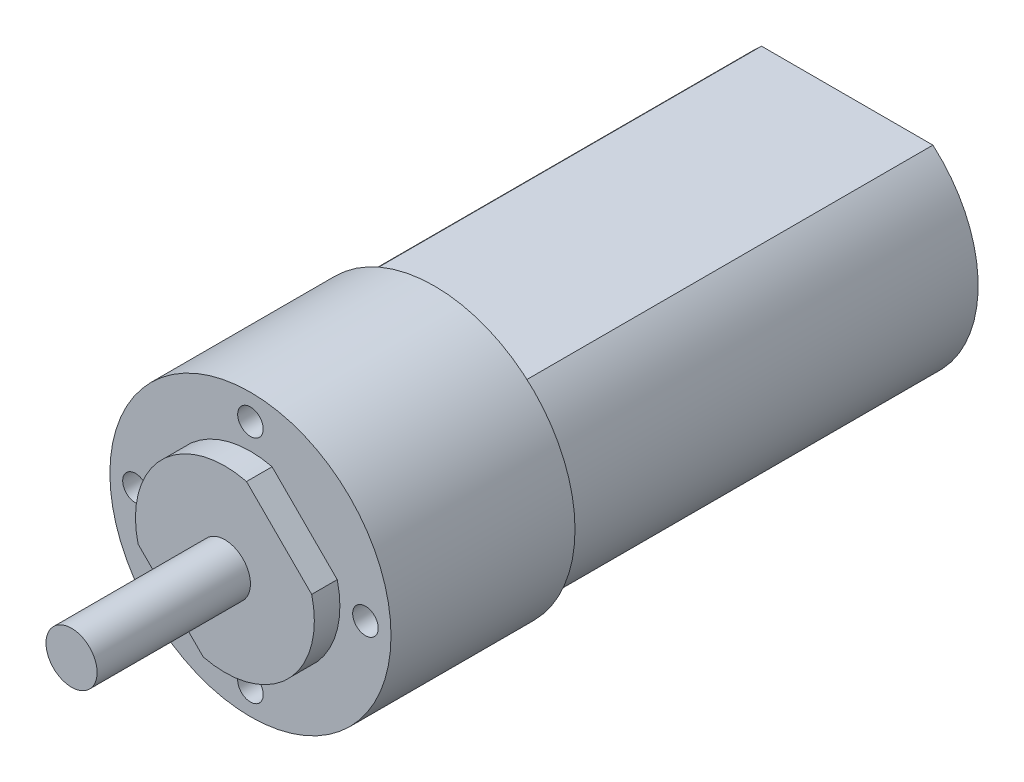
ISO-10303-21;
HEADER;
FILE_DESCRIPTION(('STEP AP214'),'2;1');
FILE_NAME('part.step','',(''),(''),'','','');
FILE_SCHEMA(('AUTOMOTIVE_DESIGN { 1 0 10303 214 1 1 1 1 }'));
ENDSEC;
DATA;
#1=APPLICATION_CONTEXT('core data for automotive mechanical design processes');
#2=APPLICATION_PROTOCOL_DEFINITION('international standard','automotive_design',2000,#1);
#3=PRODUCT_CONTEXT('',#1,'mechanical');
#4=PRODUCT('Part','Part','',(#3));
#5=PRODUCT_RELATED_PRODUCT_CATEGORY('part','',(#4));
#6=PRODUCT_DEFINITION_FORMATION('','',#4);
#7=PRODUCT_DEFINITION_CONTEXT('part definition',#1,'design');
#8=PRODUCT_DEFINITION('design','',#6,#7);
#9=PRODUCT_DEFINITION_SHAPE('','',#8);
#10=(LENGTH_UNIT() NAMED_UNIT(*) SI_UNIT(.MILLI.,.METRE.));
#11=(NAMED_UNIT(*) PLANE_ANGLE_UNIT() SI_UNIT($,.RADIAN.));
#12=(NAMED_UNIT(*) SI_UNIT($,.STERADIAN.) SOLID_ANGLE_UNIT());
#13=UNCERTAINTY_MEASURE_WITH_UNIT(LENGTH_MEASURE(1.E-05),#10,'distance_accuracy_value','');
#14=(GEOMETRIC_REPRESENTATION_CONTEXT(3) GLOBAL_UNCERTAINTY_ASSIGNED_CONTEXT((#13)) GLOBAL_UNIT_ASSIGNED_CONTEXT((#10,
#11,#12)) REPRESENTATION_CONTEXT('',''));
#15=CARTESIAN_POINT('',(0.,0.,0.));
#16=DIRECTION('',(0.,0.,1.));
#17=DIRECTION('',(1.,0.,0.));
#18=AXIS2_PLACEMENT_3D('',#15,#16,#17);
#19=CARTESIAN_POINT('',(0.,0.,48.7));
#20=DIRECTION('',(0.,0.,-1.));
#21=DIRECTION('',(-1.,0.,0.));
#22=AXIS2_PLACEMENT_3D('',#19,#20,#21);
#23=PLANE('',#22);
#24=CARTESIAN_POINT('',(0.,0.,48.7));
#25=DIRECTION('',(0.,0.,1.));
#26=DIRECTION('',(-1.,0.,0.));
#27=AXIS2_PLACEMENT_3D('',#24,#25,#26);
#28=CIRCLE('',#27,7.);
#29=CARTESIAN_POINT('',(-1.69313093032285,-6.79215044391569,48.7));
#30=VERTEX_POINT('',#29);
#31=CARTESIAN_POINT('',(6.79215044391567,1.69313093032293,48.7));
#32=VERTEX_POINT('',#31);
#33=EDGE_CURVE('E119',#30,#32,#28,.T.);
#34=ORIENTED_EDGE('',*,*,#33,.T.);
#35=DIRECTION('',(-0.707106781186551,0.707106781186543,0.));
#36=VECTOR('',#35,1.);
#37=CARTESIAN_POINT('',(1.69313093032285,6.79215044391569,48.7));
#38=LINE('',#37,#36);
#39=CARTESIAN_POINT('',(1.69313093032285,6.79215044391569,48.7));
#40=VERTEX_POINT('',#39);
#41=EDGE_CURVE('E108',#32,#40,#38,.T.);
#42=ORIENTED_EDGE('',*,*,#41,.T.);
#43=CARTESIAN_POINT('',(0.,0.,48.7));
#44=DIRECTION('',(0.,0.,1.));
#45=DIRECTION('',(-1.,0.,0.));
#46=AXIS2_PLACEMENT_3D('',#43,#44,#45);
#47=CIRCLE('',#46,7.);
#48=CARTESIAN_POINT('',(-6.79215044391567,-1.69313093032293,48.7));
#49=VERTEX_POINT('',#48);
#50=EDGE_CURVE('E118',#40,#49,#47,.T.);
#51=ORIENTED_EDGE('',*,*,#50,.T.);
#52=DIRECTION('',(0.707106781186552,-0.707106781186543,0.));
#53=VECTOR('',#52,1.);
#54=CARTESIAN_POINT('',(-1.69313093032285,-6.79215044391569,48.7));
#55=LINE('',#54,#53);
#56=EDGE_CURVE('E123',#49,#30,#55,.T.);
#57=ORIENTED_EDGE('',*,*,#56,.T.);
#58=EDGE_LOOP('',(#34,#42,#51,#57));
#59=FACE_BOUND('',#58,.T.);
#60=CARTESIAN_POINT('',(0.,0.,48.7));
#61=DIRECTION('',(0.,0.,-1.));
#62=DIRECTION('',(-1.,0.,0.));
#63=AXIS2_PLACEMENT_3D('',#60,#61,#62);
#64=CIRCLE('',#63,2.);
#65=CARTESIAN_POINT('',(-2.,0.,48.7));
#66=VERTEX_POINT('',#65);
#67=EDGE_CURVE('E11',#66,#66,#64,.F.);
#68=ORIENTED_EDGE('',*,*,#67,.F.);
#69=EDGE_LOOP('',(#68));
#70=FACE_BOUND('',#69,.T.);
#71=ADVANCED_FACE('F32',(#59,#70),#23,.F.);
#72=CARTESIAN_POINT('',(0.,0.,46.7));
#73=DIRECTION('',(0.,0.,1.));
#74=DIRECTION('',(1.,0.,0.));
#75=AXIS2_PLACEMENT_3D('',#72,#73,#74);
#76=PLANE('',#75);
#77=CARTESIAN_POINT('',(0.,-9.,46.7));
#78=DIRECTION('',(0.,0.,1.));
#79=DIRECTION('',(1.,0.,0.));
#80=AXIS2_PLACEMENT_3D('',#77,#78,#79);
#81=CIRCLE('',#80,1.);
#82=CARTESIAN_POINT('',(1.00000000000007,-9.,46.7));
#83=VERTEX_POINT('',#82);
#84=EDGE_CURVE('E391',#83,#83,#81,.T.);
#85=ORIENTED_EDGE('',*,*,#84,.F.);
#86=EDGE_LOOP('',(#85));
#87=FACE_BOUND('',#86,.T.);
#88=CARTESIAN_POINT('',(9.,0.,46.7));
#89=DIRECTION('',(0.,0.,1.));
#90=DIRECTION('',(1.,0.,0.));
#91=AXIS2_PLACEMENT_3D('',#88,#89,#90);
#92=CIRCLE('',#91,1.);
#93=CARTESIAN_POINT('',(10.,0.,46.7));
#94=VERTEX_POINT('',#93);
#95=EDGE_CURVE('E390',#94,#94,#92,.T.);
#96=ORIENTED_EDGE('',*,*,#95,.F.);
#97=EDGE_LOOP('',(#96));
#98=FACE_BOUND('',#97,.T.);
#99=CARTESIAN_POINT('',(0.,9.,46.7));
#100=DIRECTION('',(0.,0.,1.));
#101=DIRECTION('',(1.,0.,0.));
#102=AXIS2_PLACEMENT_3D('',#99,#100,#101);
#103=CIRCLE('',#102,0.999999999999999);
#104=CARTESIAN_POINT('',(0.999999999999928,9.,46.7));
#105=VERTEX_POINT('',#104);
#106=EDGE_CURVE('E400',#105,#105,#103,.T.);
#107=ORIENTED_EDGE('',*,*,#106,.F.);
#108=EDGE_LOOP('',(#107));
#109=FACE_BOUND('',#108,.T.);
#110=CARTESIAN_POINT('',(-9.,0.,46.7));
#111=DIRECTION('',(0.,0.,1.));
#112=DIRECTION('',(1.,0.,0.));
#113=AXIS2_PLACEMENT_3D('',#110,#111,#112);
#114=CIRCLE('',#113,1.);
#115=CARTESIAN_POINT('',(-8.,0.,46.7));
#116=VERTEX_POINT('',#115);
#117=EDGE_CURVE('E405',#116,#116,#114,.T.);
#118=ORIENTED_EDGE('',*,*,#117,.F.);
#119=EDGE_LOOP('',(#118));
#120=FACE_BOUND('',#119,.T.);
#121=CARTESIAN_POINT('',(0.,0.,46.7));
#122=DIRECTION('',(0.,0.,1.));
#123=DIRECTION('',(1.,0.,0.));
#124=AXIS2_PLACEMENT_3D('',#121,#122,#123);
#125=CIRCLE('',#124,11.);
#126=CARTESIAN_POINT('',(11.,0.,46.7));
#127=VERTEX_POINT('',#126);
#128=EDGE_CURVE('E136',#127,#127,#125,.T.);
#129=ORIENTED_EDGE('',*,*,#128,.T.);
#130=EDGE_LOOP('',(#129));
#131=FACE_BOUND('',#130,.T.);
#132=DIRECTION('',(-0.707106781186551,0.707106781186543,0.));
#133=VECTOR('',#132,1.);
#134=CARTESIAN_POINT('',(1.69313093032285,6.79215044391569,46.7));
#135=LINE('',#134,#133);
#136=CARTESIAN_POINT('',(6.79215044391567,1.69313093032293,46.7));
#137=VERTEX_POINT('',#136);
#138=CARTESIAN_POINT('',(1.69313093032285,6.79215044391569,46.7));
#139=VERTEX_POINT('',#138);
#140=EDGE_CURVE('E420',#137,#139,#135,.T.);
#141=ORIENTED_EDGE('',*,*,#140,.F.);
#142=CARTESIAN_POINT('',(0.,0.,46.7));
#143=DIRECTION('',(0.,0.,1.));
#144=DIRECTION('',(-1.,0.,0.));
#145=AXIS2_PLACEMENT_3D('',#142,#143,#144);
#146=CIRCLE('',#145,7.);
#147=CARTESIAN_POINT('',(-1.69313093032285,-6.79215044391569,46.7));
#148=VERTEX_POINT('',#147);
#149=EDGE_CURVE('E131',#148,#137,#146,.T.);
#150=ORIENTED_EDGE('',*,*,#149,.F.);
#151=DIRECTION('',(0.707106781186552,-0.707106781186543,0.));
#152=VECTOR('',#151,1.);
#153=CARTESIAN_POINT('',(-1.69313093032285,-6.79215044391569,46.7));
#154=LINE('',#153,#152);
#155=CARTESIAN_POINT('',(-6.79215044391567,-1.69313093032293,46.7));
#156=VERTEX_POINT('',#155);
#157=EDGE_CURVE('E127',#156,#148,#154,.T.);
#158=ORIENTED_EDGE('',*,*,#157,.F.);
#159=CARTESIAN_POINT('',(0.,0.,46.7));
#160=DIRECTION('',(0.,0.,1.));
#161=DIRECTION('',(-1.,0.,0.));
#162=AXIS2_PLACEMENT_3D('',#159,#160,#161);
#163=CIRCLE('',#162,7.);
#164=EDGE_CURVE('E422',#139,#156,#163,.T.);
#165=ORIENTED_EDGE('',*,*,#164,.F.);
#166=EDGE_LOOP('',(#141,#150,#158,#165));
#167=FACE_BOUND('',#166,.T.);
#168=ADVANCED_FACE('F190',(#87,#98,#109,#120,#131,#167),#76,.T.);
#169=CARTESIAN_POINT('',(0.,0.,32.3));
#170=DIRECTION('',(0.,0.,-1.));
#171=DIRECTION('',(-1.,0.,0.));
#172=AXIS2_PLACEMENT_3D('',#169,#170,#171);
#173=CYLINDRICAL_SURFACE('',#172,10.25);
#174=CARTESIAN_POINT('',(0.,0.,0.));
#175=DIRECTION('',(0.,0.,1.));
#176=DIRECTION('',(-1.,0.,0.));
#177=AXIS2_PLACEMENT_3D('',#174,#175,#176);
#178=CIRCLE('',#177,10.25);
#179=CARTESIAN_POINT('',(6.70820393249937,-7.75,0.));
#180=VERTEX_POINT('',#179);
#181=CARTESIAN_POINT('',(6.70820393249938,7.75,0.));
#182=VERTEX_POINT('',#181);
#183=EDGE_CURVE('E142',#180,#182,#178,.T.);
#184=ORIENTED_EDGE('',*,*,#183,.T.);
#185=DIRECTION('',(0.,0.,-1.));
#186=VECTOR('',#185,1.);
#187=CARTESIAN_POINT('',(6.70820393249938,7.75,32.3));
#188=LINE('',#187,#186);
#189=CARTESIAN_POINT('',(6.70820393249938,7.75,32.3));
#190=VERTEX_POINT('',#189);
#191=EDGE_CURVE('E40',#190,#182,#188,.T.);
#192=ORIENTED_EDGE('',*,*,#191,.F.);
#193=CARTESIAN_POINT('',(0.,0.,32.3));
#194=DIRECTION('',(0.,0.,1.));
#195=DIRECTION('',(-1.,0.,0.));
#196=AXIS2_PLACEMENT_3D('',#193,#194,#195);
#197=CIRCLE('',#196,10.25);
#198=CARTESIAN_POINT('',(6.70820393249937,-7.75,32.3));
#199=VERTEX_POINT('',#198);
#200=EDGE_CURVE('E144',#199,#190,#197,.T.);
#201=ORIENTED_EDGE('',*,*,#200,.F.);
#202=DIRECTION('',(0.,0.,-1.));
#203=VECTOR('',#202,1.);
#204=CARTESIAN_POINT('',(6.70820393249937,-7.75,32.3));
#205=LINE('',#204,#203);
#206=EDGE_CURVE('E154',#199,#180,#205,.T.);
#207=ORIENTED_EDGE('',*,*,#206,.T.);
#208=EDGE_LOOP('',(#184,#192,#201,#207));
#209=FACE_BOUND('',#208,.T.);
#210=ADVANCED_FACE('F34',(#209),#173,.T.);
#211=CARTESIAN_POINT('',(-6.70820393249938,7.75,32.3));
#212=DIRECTION('',(0.,-1.,0.));
#213=DIRECTION('',(0.,0.,-1.));
#214=AXIS2_PLACEMENT_3D('',#211,#212,#213);
#215=PLANE('',#214);
#216=DIRECTION('',(-1.,0.,0.));
#217=VECTOR('',#216,1.);
#218=CARTESIAN_POINT('',(-6.70820393249938,7.75,0.));
#219=LINE('',#218,#217);
#220=CARTESIAN_POINT('',(-6.70820393249938,7.75,0.));
#221=VERTEX_POINT('',#220);
#222=EDGE_CURVE('E157',#182,#221,#219,.T.);
#223=ORIENTED_EDGE('',*,*,#222,.T.);
#224=DIRECTION('',(0.,0.,-1.));
#225=VECTOR('',#224,1.);
#226=CARTESIAN_POINT('',(-6.70820393249938,7.75,32.3));
#227=LINE('',#226,#225);
#228=CARTESIAN_POINT('',(-6.70820393249938,7.75,32.3));
#229=VERTEX_POINT('',#228);
#230=EDGE_CURVE('E164',#229,#221,#227,.T.);
#231=ORIENTED_EDGE('',*,*,#230,.F.);
#232=DIRECTION('',(-1.,0.,0.));
#233=VECTOR('',#232,1.);
#234=CARTESIAN_POINT('',(-6.70820393249938,7.75,32.3));
#235=LINE('',#234,#233);
#236=EDGE_CURVE('E82',#190,#229,#235,.T.);
#237=ORIENTED_EDGE('',*,*,#236,.F.);
#238=ORIENTED_EDGE('',*,*,#191,.T.);
#239=EDGE_LOOP('',(#223,#231,#237,#238));
#240=FACE_BOUND('',#239,.T.);
#241=ADVANCED_FACE('F166',(#240),#215,.F.);
#242=CARTESIAN_POINT('',(0.,0.,32.3));
#243=DIRECTION('',(0.,0.,-1.));
#244=DIRECTION('',(-1.,0.,0.));
#245=AXIS2_PLACEMENT_3D('',#242,#243,#244);
#246=CYLINDRICAL_SURFACE('',#245,10.25);
#247=CARTESIAN_POINT('',(0.,0.,0.));
#248=DIRECTION('',(0.,0.,1.));
#249=DIRECTION('',(1.,0.,0.));
#250=AXIS2_PLACEMENT_3D('',#247,#248,#249);
#251=CIRCLE('',#250,10.25);
#252=CARTESIAN_POINT('',(-6.70820393249937,-7.75,0.));
#253=VERTEX_POINT('',#252);
#254=EDGE_CURVE('E159',#221,#253,#251,.T.);
#255=ORIENTED_EDGE('',*,*,#254,.T.);
#256=DIRECTION('',(0.,0.,-1.));
#257=VECTOR('',#256,1.);
#258=CARTESIAN_POINT('',(-6.70820393249937,-7.75,32.3));
#259=LINE('',#258,#257);
#260=CARTESIAN_POINT('',(-6.70820393249937,-7.75,32.3));
#261=VERTEX_POINT('',#260);
#262=EDGE_CURVE('E56',#261,#253,#259,.T.);
#263=ORIENTED_EDGE('',*,*,#262,.F.);
#264=CARTESIAN_POINT('',(0.,0.,32.3));
#265=DIRECTION('',(0.,0.,1.));
#266=DIRECTION('',(1.,0.,0.));
#267=AXIS2_PLACEMENT_3D('',#264,#265,#266);
#268=CIRCLE('',#267,10.25);
#269=EDGE_CURVE('E148',#229,#261,#268,.T.);
#270=ORIENTED_EDGE('',*,*,#269,.F.);
#271=ORIENTED_EDGE('',*,*,#230,.T.);
#272=EDGE_LOOP('',(#255,#263,#270,#271));
#273=FACE_BOUND('',#272,.T.);
#274=ADVANCED_FACE('F172',(#273),#246,.T.);
#275=CARTESIAN_POINT('',(6.70820393249937,-7.75,32.3));
#276=DIRECTION('',(0.,1.,0.));
#277=DIRECTION('',(-1.,0.,0.));
#278=AXIS2_PLACEMENT_3D('',#275,#276,#277);
#279=PLANE('',#278);
#280=DIRECTION('',(1.,0.,0.));
#281=VECTOR('',#280,1.);
#282=CARTESIAN_POINT('',(6.70820393249937,-7.75,0.));
#283=LINE('',#282,#281);
#284=EDGE_CURVE('E76',#253,#180,#283,.T.);
#285=ORIENTED_EDGE('',*,*,#284,.T.);
#286=ORIENTED_EDGE('',*,*,#206,.F.);
#287=DIRECTION('',(1.,0.,0.));
#288=VECTOR('',#287,1.);
#289=CARTESIAN_POINT('',(6.70820393249937,-7.75,32.3));
#290=LINE('',#289,#288);
#291=EDGE_CURVE('E151',#261,#199,#290,.T.);
#292=ORIENTED_EDGE('',*,*,#291,.F.);
#293=ORIENTED_EDGE('',*,*,#262,.T.);
#294=EDGE_LOOP('',(#285,#286,#292,#293));
#295=FACE_BOUND('',#294,.T.);
#296=ADVANCED_FACE('F173',(#295),#279,.F.);
#297=CARTESIAN_POINT('',(0.,0.,0.));
#298=DIRECTION('',(0.,0.,-1.));
#299=DIRECTION('',(-1.,0.,0.));
#300=AXIS2_PLACEMENT_3D('',#297,#298,#299);
#301=PLANE('',#300);
#302=ORIENTED_EDGE('',*,*,#183,.F.);
#303=ORIENTED_EDGE('',*,*,#284,.F.);
#304=ORIENTED_EDGE('',*,*,#254,.F.);
#305=ORIENTED_EDGE('',*,*,#222,.F.);
#306=EDGE_LOOP('',(#302,#303,#304,#305));
#307=FACE_BOUND('',#306,.T.);
#308=ADVANCED_FACE('F170',(#307),#301,.T.);
#309=CARTESIAN_POINT('',(0.,0.,32.3));
#310=DIRECTION('',(0.,0.,1.));
#311=DIRECTION('',(1.,0.,0.));
#312=AXIS2_PLACEMENT_3D('',#309,#310,#311);
#313=PLANE('',#312);
#314=CARTESIAN_POINT('',(0.,0.,32.3));
#315=DIRECTION('',(0.,0.,1.));
#316=DIRECTION('',(1.,0.,0.));
#317=AXIS2_PLACEMENT_3D('',#314,#315,#316);
#318=CIRCLE('',#317,11.);
#319=CARTESIAN_POINT('',(11.,0.,32.3));
#320=VERTEX_POINT('',#319);
#321=EDGE_CURVE('E133',#320,#320,#318,.T.);
#322=ORIENTED_EDGE('',*,*,#321,.F.);
#323=EDGE_LOOP('',(#322));
#324=FACE_BOUND('',#323,.T.);
#325=ORIENTED_EDGE('',*,*,#291,.T.);
#326=ORIENTED_EDGE('',*,*,#200,.T.);
#327=ORIENTED_EDGE('',*,*,#236,.T.);
#328=ORIENTED_EDGE('',*,*,#269,.T.);
#329=EDGE_LOOP('',(#325,#326,#327,#328));
#330=FACE_BOUND('',#329,.T.);
#331=ADVANCED_FACE('F175',(#324,#330),#313,.F.);
#332=CARTESIAN_POINT('',(0.,0.,46.7));
#333=DIRECTION('',(0.,0.,-1.));
#334=DIRECTION('',(-1.,0.,0.));
#335=AXIS2_PLACEMENT_3D('',#332,#333,#334);
#336=CYLINDRICAL_SURFACE('',#335,11.);
#337=ORIENTED_EDGE('',*,*,#128,.F.);
#338=EDGE_LOOP('',(#337));
#339=FACE_BOUND('',#338,.T.);
#340=ORIENTED_EDGE('',*,*,#321,.T.);
#341=EDGE_LOOP('',(#340));
#342=FACE_BOUND('',#341,.T.);
#343=ADVANCED_FACE('F177',(#339,#342),#336,.T.);
#344=CARTESIAN_POINT('',(0.,0.,48.7));
#345=DIRECTION('',(0.,0.,-1.));
#346=DIRECTION('',(-1.,0.,0.));
#347=AXIS2_PLACEMENT_3D('',#344,#345,#346);
#348=CYLINDRICAL_SURFACE('',#347,7.);
#349=ORIENTED_EDGE('',*,*,#149,.T.);
#350=DIRECTION('',(0.,0.,-1.));
#351=VECTOR('',#350,1.);
#352=CARTESIAN_POINT('',(6.79215044391567,1.69313093032293,48.7));
#353=LINE('',#352,#351);
#354=EDGE_CURVE('E112',#32,#137,#353,.T.);
#355=ORIENTED_EDGE('',*,*,#354,.F.);
#356=ORIENTED_EDGE('',*,*,#33,.F.);
#357=DIRECTION('',(0.,0.,-1.));
#358=VECTOR('',#357,1.);
#359=CARTESIAN_POINT('',(-1.69313093032285,-6.79215044391569,48.7));
#360=LINE('',#359,#358);
#361=EDGE_CURVE('E418',#30,#148,#360,.T.);
#362=ORIENTED_EDGE('',*,*,#361,.T.);
#363=EDGE_LOOP('',(#349,#355,#356,#362));
#364=FACE_BOUND('',#363,.T.);
#365=ADVANCED_FACE('F129',(#364),#348,.T.);
#366=CARTESIAN_POINT('',(1.69313093032285,6.79215044391569,48.7));
#367=DIRECTION('',(-0.707106781186543,-0.707106781186552,0.));
#368=DIRECTION('',(0.707106781186552,-0.707106781186543,0.));
#369=AXIS2_PLACEMENT_3D('',#366,#367,#368);
#370=PLANE('',#369);
#371=ORIENTED_EDGE('',*,*,#140,.T.);
#372=DIRECTION('',(0.,0.,-1.));
#373=VECTOR('',#372,1.);
#374=CARTESIAN_POINT('',(1.69313093032285,6.79215044391569,48.7));
#375=LINE('',#374,#373);
#376=EDGE_CURVE('E115',#40,#139,#375,.T.);
#377=ORIENTED_EDGE('',*,*,#376,.F.);
#378=ORIENTED_EDGE('',*,*,#41,.F.);
#379=ORIENTED_EDGE('',*,*,#354,.T.);
#380=EDGE_LOOP('',(#371,#377,#378,#379));
#381=FACE_BOUND('',#380,.T.);
#382=ADVANCED_FACE('F110',(#381),#370,.F.);
#383=CARTESIAN_POINT('',(0.,0.,48.7));
#384=DIRECTION('',(0.,0.,-1.));
#385=DIRECTION('',(-1.,0.,0.));
#386=AXIS2_PLACEMENT_3D('',#383,#384,#385);
#387=CYLINDRICAL_SURFACE('',#386,7.);
#388=ORIENTED_EDGE('',*,*,#164,.T.);
#389=DIRECTION('',(0.,0.,-1.));
#390=VECTOR('',#389,1.);
#391=CARTESIAN_POINT('',(-6.79215044391567,-1.69313093032293,48.7));
#392=LINE('',#391,#390);
#393=EDGE_CURVE('E47',#49,#156,#392,.T.);
#394=ORIENTED_EDGE('',*,*,#393,.F.);
#395=ORIENTED_EDGE('',*,*,#50,.F.);
#396=ORIENTED_EDGE('',*,*,#376,.T.);
#397=EDGE_LOOP('',(#388,#394,#395,#396));
#398=FACE_BOUND('',#397,.T.);
#399=ADVANCED_FACE('F203',(#398),#387,.T.);
#400=CARTESIAN_POINT('',(-1.69313093032285,-6.79215044391569,48.7));
#401=DIRECTION('',(0.707106781186543,0.707106781186552,0.));
#402=DIRECTION('',(-0.707106781186552,0.707106781186543,0.));
#403=AXIS2_PLACEMENT_3D('',#400,#401,#402);
#404=PLANE('',#403);
#405=ORIENTED_EDGE('',*,*,#157,.T.);
#406=ORIENTED_EDGE('',*,*,#361,.F.);
#407=ORIENTED_EDGE('',*,*,#56,.F.);
#408=ORIENTED_EDGE('',*,*,#393,.T.);
#409=EDGE_LOOP('',(#405,#406,#407,#408));
#410=FACE_BOUND('',#409,.T.);
#411=ADVANCED_FACE('F200',(#410),#404,.F.);
#412=CARTESIAN_POINT('',(0.,0.,60.7));
#413=DIRECTION('',(0.,0.,-1.));
#414=DIRECTION('',(-1.,0.,0.));
#415=AXIS2_PLACEMENT_3D('',#412,#413,#414);
#416=CYLINDRICAL_SURFACE('',#415,2.);
#417=CARTESIAN_POINT('',(0.,0.,60.7));
#418=DIRECTION('',(0.,0.,1.));
#419=DIRECTION('',(1.,0.,0.));
#420=AXIS2_PLACEMENT_3D('',#417,#418,#419);
#421=CIRCLE('',#420,2.);
#422=CARTESIAN_POINT('',(2.,0.,60.7));
#423=VERTEX_POINT('',#422);
#424=EDGE_CURVE('E411',#423,#423,#421,.T.);
#425=ORIENTED_EDGE('',*,*,#424,.F.);
#426=EDGE_LOOP('',(#425));
#427=FACE_BOUND('',#426,.T.);
#428=ORIENTED_EDGE('',*,*,#67,.T.);
#429=EDGE_LOOP('',(#428));
#430=FACE_BOUND('',#429,.T.);
#431=ADVANCED_FACE('F198',(#427,#430),#416,.T.);
#432=CARTESIAN_POINT('',(0.,0.,60.7));
#433=DIRECTION('',(0.,0.,1.));
#434=DIRECTION('',(1.,0.,0.));
#435=AXIS2_PLACEMENT_3D('',#432,#433,#434);
#436=PLANE('',#435);
#437=ORIENTED_EDGE('',*,*,#424,.T.);
#438=EDGE_LOOP('',(#437));
#439=FACE_BOUND('',#438,.T.);
#440=ADVANCED_FACE('F232',(#439),#436,.T.);
#441=CARTESIAN_POINT('',(-9.,0.,42.7));
#442=DIRECTION('',(0.,0.,1.));
#443=DIRECTION('',(1.,0.,0.));
#444=AXIS2_PLACEMENT_3D('',#441,#442,#443);
#445=CYLINDRICAL_SURFACE('',#444,1.);
#446=CARTESIAN_POINT('',(-9.,0.,42.7));
#447=DIRECTION('',(0.,0.,1.));
#448=DIRECTION('',(1.,0.,0.));
#449=AXIS2_PLACEMENT_3D('',#446,#447,#448);
#450=CIRCLE('',#449,1.);
#451=CARTESIAN_POINT('',(-8.,0.,42.7));
#452=VERTEX_POINT('',#451);
#453=EDGE_CURVE('E408',#452,#452,#450,.T.);
#454=ORIENTED_EDGE('',*,*,#453,.F.);
#455=EDGE_LOOP('',(#454));
#456=FACE_BOUND('',#455,.T.);
#457=ORIENTED_EDGE('',*,*,#117,.T.);
#458=EDGE_LOOP('',(#457));
#459=FACE_BOUND('',#458,.T.);
#460=ADVANCED_FACE('F239',(#456,#459),#445,.F.);
#461=CARTESIAN_POINT('',(-9.,0.,42.7));
#462=DIRECTION('',(0.,0.,1.));
#463=DIRECTION('',(1.,0.,0.));
#464=AXIS2_PLACEMENT_3D('',#461,#462,#463);
#465=PLANE('',#464);
#466=ORIENTED_EDGE('',*,*,#453,.T.);
#467=EDGE_LOOP('',(#466));
#468=FACE_BOUND('',#467,.T.);
#469=ADVANCED_FACE('F247',(#468),#465,.T.);
#470=CARTESIAN_POINT('',(0.,9.,42.7));
#471=DIRECTION('',(0.,0.,1.));
#472=DIRECTION('',(1.,0.,0.));
#473=AXIS2_PLACEMENT_3D('',#470,#471,#472);
#474=CYLINDRICAL_SURFACE('',#473,0.999999999999999);
#475=CARTESIAN_POINT('',(0.,9.,42.7));
#476=DIRECTION('',(0.,0.,1.));
#477=DIRECTION('',(1.,0.,0.));
#478=AXIS2_PLACEMENT_3D('',#475,#476,#477);
#479=CIRCLE('',#478,0.999999999999999);
#480=CARTESIAN_POINT('',(0.999999999999928,9.,42.7));
#481=VERTEX_POINT('',#480);
#482=EDGE_CURVE('E402',#481,#481,#479,.T.);
#483=ORIENTED_EDGE('',*,*,#482,.F.);
#484=EDGE_LOOP('',(#483));
#485=FACE_BOUND('',#484,.T.);
#486=ORIENTED_EDGE('',*,*,#106,.T.);
#487=EDGE_LOOP('',(#486));
#488=FACE_BOUND('',#487,.T.);
#489=ADVANCED_FACE('F255',(#485,#488),#474,.F.);
#490=CARTESIAN_POINT('',(0.,9.,42.7));
#491=DIRECTION('',(0.,0.,1.));
#492=DIRECTION('',(1.,0.,0.));
#493=AXIS2_PLACEMENT_3D('',#490,#491,#492);
#494=PLANE('',#493);
#495=ORIENTED_EDGE('',*,*,#482,.T.);
#496=EDGE_LOOP('',(#495));
#497=FACE_BOUND('',#496,.T.);
#498=ADVANCED_FACE('F263',(#497),#494,.T.);
#499=CARTESIAN_POINT('',(9.,0.,42.7));
#500=DIRECTION('',(0.,0.,1.));
#501=DIRECTION('',(1.,0.,0.));
#502=AXIS2_PLACEMENT_3D('',#499,#500,#501);
#503=CYLINDRICAL_SURFACE('',#502,1.);
#504=CARTESIAN_POINT('',(9.,0.,42.7));
#505=DIRECTION('',(0.,0.,1.));
#506=DIRECTION('',(1.,0.,0.));
#507=AXIS2_PLACEMENT_3D('',#504,#505,#506);
#508=CIRCLE('',#507,1.);
#509=CARTESIAN_POINT('',(10.,0.,42.7));
#510=VERTEX_POINT('',#509);
#511=EDGE_CURVE('E394',#510,#510,#508,.T.);
#512=ORIENTED_EDGE('',*,*,#511,.F.);
#513=EDGE_LOOP('',(#512));
#514=FACE_BOUND('',#513,.T.);
#515=ORIENTED_EDGE('',*,*,#95,.T.);
#516=EDGE_LOOP('',(#515));
#517=FACE_BOUND('',#516,.T.);
#518=ADVANCED_FACE('F271',(#514,#517),#503,.F.);
#519=CARTESIAN_POINT('',(9.,0.,42.7));
#520=DIRECTION('',(0.,0.,1.));
#521=DIRECTION('',(1.,0.,0.));
#522=AXIS2_PLACEMENT_3D('',#519,#520,#521);
#523=PLANE('',#522);
#524=ORIENTED_EDGE('',*,*,#511,.T.);
#525=EDGE_LOOP('',(#524));
#526=FACE_BOUND('',#525,.T.);
#527=ADVANCED_FACE('F279',(#526),#523,.T.);
#528=CARTESIAN_POINT('',(0.,-9.,42.7));
#529=DIRECTION('',(0.,0.,1.));
#530=DIRECTION('',(1.,0.,0.));
#531=AXIS2_PLACEMENT_3D('',#528,#529,#530);
#532=CYLINDRICAL_SURFACE('',#531,1.);
#533=CARTESIAN_POINT('',(0.,-9.,42.7));
#534=DIRECTION('',(0.,0.,1.));
#535=DIRECTION('',(1.,0.,0.));
#536=AXIS2_PLACEMENT_3D('',#533,#534,#535);
#537=CIRCLE('',#536,1.);
#538=CARTESIAN_POINT('',(1.00000000000007,-9.,42.7));
#539=VERTEX_POINT('',#538);
#540=EDGE_CURVE('E389',#539,#539,#537,.T.);
#541=ORIENTED_EDGE('',*,*,#540,.F.);
#542=EDGE_LOOP('',(#541));
#543=FACE_BOUND('',#542,.T.);
#544=ORIENTED_EDGE('',*,*,#84,.T.);
#545=EDGE_LOOP('',(#544));
#546=FACE_BOUND('',#545,.T.);
#547=ADVANCED_FACE('F287',(#543,#546),#532,.F.);
#548=CARTESIAN_POINT('',(0.,-9.,42.7));
#549=DIRECTION('',(0.,0.,1.));
#550=DIRECTION('',(1.,0.,0.));
#551=AXIS2_PLACEMENT_3D('',#548,#549,#550);
#552=PLANE('',#551);
#553=ORIENTED_EDGE('',*,*,#540,.T.);
#554=EDGE_LOOP('',(#553));
#555=FACE_BOUND('',#554,.T.);
#556=ADVANCED_FACE('F295',(#555),#552,.T.);
#557=CLOSED_SHELL('',(#71,#168,#210,#241,#274,#296,#308,#331,#343,#365,#382,#399,#411,#431,#440,
#460,#469,#489,#498,#518,#527,#547,#556));
#558=MANIFOLD_SOLID_BREP('B2',#557);
#559=ADVANCED_BREP_SHAPE_REPRESENTATION('',(#18,#558),#14);
#560=SHAPE_DEFINITION_REPRESENTATION(#9,#559);
ENDSEC;
END-ISO-10303-21;
